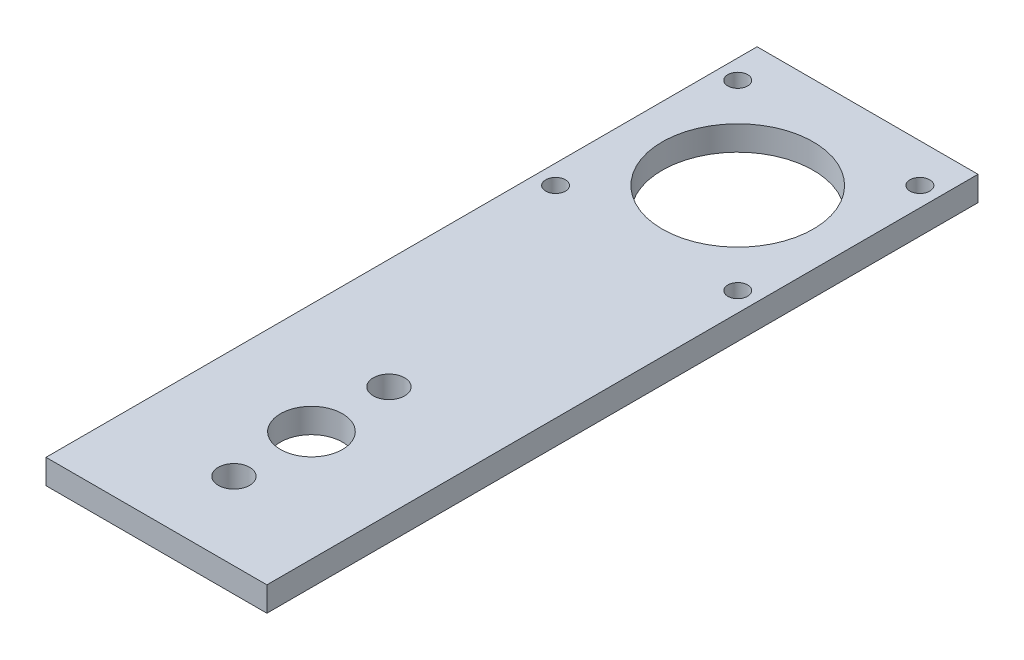
ISO-10303-21;
HEADER;
FILE_DESCRIPTION(('STEP AP214'),'2;1');
FILE_NAME('part.step','',(''),(''),'','','');
FILE_SCHEMA(('AUTOMOTIVE_DESIGN { 1 0 10303 214 1 1 1 1 }'));
ENDSEC;
DATA;
#1=APPLICATION_CONTEXT('core data for automotive mechanical design processes');
#2=APPLICATION_PROTOCOL_DEFINITION('international standard','automotive_design',2000,#1);
#3=PRODUCT_CONTEXT('',#1,'mechanical');
#4=PRODUCT('Part','Part','',(#3));
#5=PRODUCT_RELATED_PRODUCT_CATEGORY('part','',(#4));
#6=PRODUCT_DEFINITION_FORMATION('','',#4);
#7=PRODUCT_DEFINITION_CONTEXT('part definition',#1,'design');
#8=PRODUCT_DEFINITION('design','',#6,#7);
#9=PRODUCT_DEFINITION_SHAPE('','',#8);
#10=(LENGTH_UNIT() NAMED_UNIT(*) SI_UNIT(.MILLI.,.METRE.));
#11=(NAMED_UNIT(*) PLANE_ANGLE_UNIT() SI_UNIT($,.RADIAN.));
#12=(NAMED_UNIT(*) SI_UNIT($,.STERADIAN.) SOLID_ANGLE_UNIT());
#13=UNCERTAINTY_MEASURE_WITH_UNIT(LENGTH_MEASURE(1.E-05),#10,'distance_accuracy_value','');
#14=(GEOMETRIC_REPRESENTATION_CONTEXT(3) GLOBAL_UNCERTAINTY_ASSIGNED_CONTEXT((#13)) GLOBAL_UNIT_ASSIGNED_CONTEXT((#10,
#11,#12)) REPRESENTATION_CONTEXT('',''));
#15=CARTESIAN_POINT('',(0.,0.,0.));
#16=DIRECTION('',(0.,0.,1.));
#17=DIRECTION('',(1.,0.,0.));
#18=AXIS2_PLACEMENT_3D('',#15,#16,#17);
#19=CARTESIAN_POINT('',(0.,6.35,0.));
#20=DIRECTION('',(0.,1.,0.));
#21=DIRECTION('',(0.,0.,1.));
#22=AXIS2_PLACEMENT_3D('',#19,#20,#21);
#23=PLANE('',#22);
#24=CARTESIAN_POINT('',(0.,6.35,130.));
#25=DIRECTION('',(0.,1.,0.));
#26=DIRECTION('',(0.,0.,1.));
#27=AXIS2_PLACEMENT_3D('',#24,#25,#26);
#28=CIRCLE('',#27,4.05);
#29=CARTESIAN_POINT('',(0.,6.35,134.05));
#30=VERTEX_POINT('',#29);
#31=EDGE_CURVE('E144',#30,#30,#28,.T.);
#32=ORIENTED_EDGE('',*,*,#31,.F.);
#33=EDGE_LOOP('',(#32));
#34=FACE_BOUND('',#33,.T.);
#35=CARTESIAN_POINT('',(-23.5,6.35,23.5));
#36=DIRECTION('',(0.,1.,0.));
#37=DIRECTION('',(0.,0.,1.));
#38=AXIS2_PLACEMENT_3D('',#35,#36,#37);
#39=CIRCLE('',#38,2.55);
#40=CARTESIAN_POINT('',(-23.5,6.35,26.05));
#41=VERTEX_POINT('',#40);
#42=EDGE_CURVE('E132',#41,#41,#39,.T.);
#43=ORIENTED_EDGE('',*,*,#42,.F.);
#44=EDGE_LOOP('',(#43));
#45=FACE_BOUND('',#44,.T.);
#46=CARTESIAN_POINT('',(23.5,6.35,-23.5));
#47=DIRECTION('',(0.,1.,0.));
#48=DIRECTION('',(0.,0.,1.));
#49=AXIS2_PLACEMENT_3D('',#46,#47,#48);
#50=CIRCLE('',#49,2.55);
#51=CARTESIAN_POINT('',(23.5,6.35,-20.95));
#52=VERTEX_POINT('',#51);
#53=EDGE_CURVE('E120',#52,#52,#50,.T.);
#54=ORIENTED_EDGE('',*,*,#53,.F.);
#55=EDGE_LOOP('',(#54));
#56=FACE_BOUND('',#55,.T.);
#57=CARTESIAN_POINT('',(0.,6.35,0.));
#58=DIRECTION('',(0.,1.,0.));
#59=DIRECTION('',(0.,0.,1.));
#60=AXIS2_PLACEMENT_3D('',#57,#58,#59);
#61=CIRCLE('',#60,19.5);
#62=CARTESIAN_POINT('',(0.,6.35,19.5));
#63=VERTEX_POINT('',#62);
#64=EDGE_CURVE('E99',#63,#63,#61,.T.);
#65=ORIENTED_EDGE('',*,*,#64,.F.);
#66=EDGE_LOOP('',(#65));
#67=FACE_BOUND('',#66,.T.);
#68=DIRECTION('',(0.,0.,1.));
#69=VECTOR('',#68,1.);
#70=CARTESIAN_POINT('',(-28.5,6.35,-33.5));
#71=LINE('',#70,#69);
#72=CARTESIAN_POINT('',(-28.5,6.35,-33.5));
#73=VERTEX_POINT('',#72);
#74=CARTESIAN_POINT('',(-28.5,6.35,150.));
#75=VERTEX_POINT('',#74);
#76=EDGE_CURVE('E84',#73,#75,#71,.T.);
#77=ORIENTED_EDGE('',*,*,#76,.T.);
#78=DIRECTION('',(1.,0.,0.));
#79=VECTOR('',#78,1.);
#80=CARTESIAN_POINT('',(-28.5,6.35,150.));
#81=LINE('',#80,#79);
#82=CARTESIAN_POINT('',(28.5,6.35,150.));
#83=VERTEX_POINT('',#82);
#84=EDGE_CURVE('E79',#75,#83,#81,.T.);
#85=ORIENTED_EDGE('',*,*,#84,.T.);
#86=DIRECTION('',(0.,0.,-1.));
#87=VECTOR('',#86,1.);
#88=CARTESIAN_POINT('',(28.5,6.35,-33.5));
#89=LINE('',#88,#87);
#90=CARTESIAN_POINT('',(28.5,6.35,-33.5));
#91=VERTEX_POINT('',#90);
#92=EDGE_CURVE('E82',#83,#91,#89,.T.);
#93=ORIENTED_EDGE('',*,*,#92,.T.);
#94=DIRECTION('',(-1.,0.,0.));
#95=VECTOR('',#94,1.);
#96=CARTESIAN_POINT('',(-28.5,6.35,-33.5));
#97=LINE('',#96,#95);
#98=EDGE_CURVE('E49',#91,#73,#97,.T.);
#99=ORIENTED_EDGE('',*,*,#98,.T.);
#100=EDGE_LOOP('',(#77,#85,#93,#99));
#101=FACE_BOUND('',#100,.T.);
#102=CARTESIAN_POINT('',(-23.5,6.35,-23.5));
#103=DIRECTION('',(0.,1.,0.));
#104=DIRECTION('',(0.,0.,1.));
#105=AXIS2_PLACEMENT_3D('',#102,#103,#104);
#106=CIRCLE('',#105,2.55);
#107=CARTESIAN_POINT('',(-23.5,6.35,-20.95));
#108=VERTEX_POINT('',#107);
#109=EDGE_CURVE('E114',#108,#108,#106,.T.);
#110=ORIENTED_EDGE('',*,*,#109,.F.);
#111=EDGE_LOOP('',(#110));
#112=FACE_BOUND('',#111,.T.);
#113=CARTESIAN_POINT('',(23.5,6.35,23.5));
#114=DIRECTION('',(0.,1.,0.));
#115=DIRECTION('',(0.,0.,1.));
#116=AXIS2_PLACEMENT_3D('',#113,#114,#115);
#117=CIRCLE('',#116,2.55);
#118=CARTESIAN_POINT('',(23.5,6.35,26.05));
#119=VERTEX_POINT('',#118);
#120=EDGE_CURVE('E126',#119,#119,#117,.T.);
#121=ORIENTED_EDGE('',*,*,#120,.F.);
#122=EDGE_LOOP('',(#121));
#123=FACE_BOUND('',#122,.T.);
#124=CARTESIAN_POINT('',(0.,6.35,90.));
#125=DIRECTION('',(0.,1.,0.));
#126=DIRECTION('',(0.,0.,1.));
#127=AXIS2_PLACEMENT_3D('',#124,#125,#126);
#128=CIRCLE('',#127,4.05);
#129=CARTESIAN_POINT('',(0.,6.35,94.05));
#130=VERTEX_POINT('',#129);
#131=EDGE_CURVE('E138',#130,#130,#128,.T.);
#132=ORIENTED_EDGE('',*,*,#131,.F.);
#133=EDGE_LOOP('',(#132));
#134=FACE_BOUND('',#133,.T.);
#135=CARTESIAN_POINT('',(0.,6.35,110.));
#136=DIRECTION('',(0.,1.,0.));
#137=DIRECTION('',(0.,0.,1.));
#138=AXIS2_PLACEMENT_3D('',#135,#136,#137);
#139=CIRCLE('',#138,8.00000000000001);
#140=CARTESIAN_POINT('',(0.,6.35,118.));
#141=VERTEX_POINT('',#140);
#142=EDGE_CURVE('E150',#141,#141,#139,.T.);
#143=ORIENTED_EDGE('',*,*,#142,.F.);
#144=EDGE_LOOP('',(#143));
#145=FACE_BOUND('',#144,.T.);
#146=ADVANCED_FACE('F32',(#34,#45,#56,#67,#101,#112,#123,#134,#145),#23,.T.);
#147=CARTESIAN_POINT('',(0.,0.,0.));
#148=DIRECTION('',(0.,1.,0.));
#149=DIRECTION('',(0.,0.,1.));
#150=AXIS2_PLACEMENT_3D('',#147,#148,#149);
#151=PLANE('',#150);
#152=CARTESIAN_POINT('',(0.,0.,130.));
#153=DIRECTION('',(0.,1.,0.));
#154=DIRECTION('',(0.,0.,1.));
#155=AXIS2_PLACEMENT_3D('',#152,#153,#154);
#156=CIRCLE('',#155,4.05);
#157=CARTESIAN_POINT('',(0.,0.,134.05));
#158=VERTEX_POINT('',#157);
#159=EDGE_CURVE('E147',#158,#158,#156,.T.);
#160=ORIENTED_EDGE('',*,*,#159,.T.);
#161=EDGE_LOOP('',(#160));
#162=FACE_BOUND('',#161,.T.);
#163=CARTESIAN_POINT('',(-23.5,0.,23.5));
#164=DIRECTION('',(0.,1.,0.));
#165=DIRECTION('',(0.,0.,1.));
#166=AXIS2_PLACEMENT_3D('',#163,#164,#165);
#167=CIRCLE('',#166,2.55);
#168=CARTESIAN_POINT('',(-23.5,0.,26.05));
#169=VERTEX_POINT('',#168);
#170=EDGE_CURVE('E135',#169,#169,#167,.T.);
#171=ORIENTED_EDGE('',*,*,#170,.T.);
#172=EDGE_LOOP('',(#171));
#173=FACE_BOUND('',#172,.T.);
#174=CARTESIAN_POINT('',(23.5,0.,-23.5));
#175=DIRECTION('',(0.,1.,0.));
#176=DIRECTION('',(0.,0.,1.));
#177=AXIS2_PLACEMENT_3D('',#174,#175,#176);
#178=CIRCLE('',#177,2.55);
#179=CARTESIAN_POINT('',(23.5,0.,-20.95));
#180=VERTEX_POINT('',#179);
#181=EDGE_CURVE('E123',#180,#180,#178,.T.);
#182=ORIENTED_EDGE('',*,*,#181,.T.);
#183=EDGE_LOOP('',(#182));
#184=FACE_BOUND('',#183,.T.);
#185=CARTESIAN_POINT('',(0.,0.,0.));
#186=DIRECTION('',(0.,1.,0.));
#187=DIRECTION('',(0.,0.,1.));
#188=AXIS2_PLACEMENT_3D('',#185,#186,#187);
#189=CIRCLE('',#188,19.5);
#190=CARTESIAN_POINT('',(0.,0.,19.5));
#191=VERTEX_POINT('',#190);
#192=EDGE_CURVE('E111',#191,#191,#189,.T.);
#193=ORIENTED_EDGE('',*,*,#192,.T.);
#194=EDGE_LOOP('',(#193));
#195=FACE_BOUND('',#194,.T.);
#196=DIRECTION('',(0.,0.,1.));
#197=VECTOR('',#196,1.);
#198=CARTESIAN_POINT('',(-28.5,0.,-33.5));
#199=LINE('',#198,#197);
#200=CARTESIAN_POINT('',(-28.5,0.,-33.5));
#201=VERTEX_POINT('',#200);
#202=CARTESIAN_POINT('',(-28.5,0.,150.));
#203=VERTEX_POINT('',#202);
#204=EDGE_CURVE('E96',#201,#203,#199,.T.);
#205=ORIENTED_EDGE('',*,*,#204,.F.);
#206=DIRECTION('',(-1.,0.,0.));
#207=VECTOR('',#206,1.);
#208=CARTESIAN_POINT('',(-28.5,0.,-33.5));
#209=LINE('',#208,#207);
#210=CARTESIAN_POINT('',(28.5,0.,-33.5));
#211=VERTEX_POINT('',#210);
#212=EDGE_CURVE('E72',#211,#201,#209,.T.);
#213=ORIENTED_EDGE('',*,*,#212,.F.);
#214=DIRECTION('',(0.,0.,-1.));
#215=VECTOR('',#214,1.);
#216=CARTESIAN_POINT('',(28.5,0.,-33.5));
#217=LINE('',#216,#215);
#218=CARTESIAN_POINT('',(28.5,0.,150.));
#219=VERTEX_POINT('',#218);
#220=EDGE_CURVE('E66',#219,#211,#217,.T.);
#221=ORIENTED_EDGE('',*,*,#220,.F.);
#222=DIRECTION('',(1.,0.,0.));
#223=VECTOR('',#222,1.);
#224=CARTESIAN_POINT('',(-28.5,0.,150.));
#225=LINE('',#224,#223);
#226=EDGE_CURVE('E88',#203,#219,#225,.T.);
#227=ORIENTED_EDGE('',*,*,#226,.F.);
#228=EDGE_LOOP('',(#205,#213,#221,#227));
#229=FACE_BOUND('',#228,.T.);
#230=CARTESIAN_POINT('',(-23.5,0.,-23.5));
#231=DIRECTION('',(0.,1.,0.));
#232=DIRECTION('',(0.,0.,1.));
#233=AXIS2_PLACEMENT_3D('',#230,#231,#232);
#234=CIRCLE('',#233,2.55);
#235=CARTESIAN_POINT('',(-23.5,0.,-20.95));
#236=VERTEX_POINT('',#235);
#237=EDGE_CURVE('E117',#236,#236,#234,.T.);
#238=ORIENTED_EDGE('',*,*,#237,.T.);
#239=EDGE_LOOP('',(#238));
#240=FACE_BOUND('',#239,.T.);
#241=CARTESIAN_POINT('',(23.5,0.,23.5));
#242=DIRECTION('',(0.,1.,0.));
#243=DIRECTION('',(0.,0.,1.));
#244=AXIS2_PLACEMENT_3D('',#241,#242,#243);
#245=CIRCLE('',#244,2.55);
#246=CARTESIAN_POINT('',(23.5,0.,26.05));
#247=VERTEX_POINT('',#246);
#248=EDGE_CURVE('E129',#247,#247,#245,.T.);
#249=ORIENTED_EDGE('',*,*,#248,.T.);
#250=EDGE_LOOP('',(#249));
#251=FACE_BOUND('',#250,.T.);
#252=CARTESIAN_POINT('',(0.,0.,90.));
#253=DIRECTION('',(0.,1.,0.));
#254=DIRECTION('',(0.,0.,1.));
#255=AXIS2_PLACEMENT_3D('',#252,#253,#254);
#256=CIRCLE('',#255,4.05);
#257=CARTESIAN_POINT('',(0.,0.,94.05));
#258=VERTEX_POINT('',#257);
#259=EDGE_CURVE('E141',#258,#258,#256,.T.);
#260=ORIENTED_EDGE('',*,*,#259,.T.);
#261=EDGE_LOOP('',(#260));
#262=FACE_BOUND('',#261,.T.);
#263=CARTESIAN_POINT('',(0.,0.,110.));
#264=DIRECTION('',(0.,1.,0.));
#265=DIRECTION('',(0.,0.,1.));
#266=AXIS2_PLACEMENT_3D('',#263,#264,#265);
#267=CIRCLE('',#266,8.00000000000001);
#268=CARTESIAN_POINT('',(0.,0.,118.));
#269=VERTEX_POINT('',#268);
#270=EDGE_CURVE('E153',#269,#269,#267,.T.);
#271=ORIENTED_EDGE('',*,*,#270,.T.);
#272=EDGE_LOOP('',(#271));
#273=FACE_BOUND('',#272,.T.);
#274=ADVANCED_FACE('F107',(#162,#173,#184,#195,#229,#240,#251,#262,#273),#151,.F.);
#275=CARTESIAN_POINT('',(-28.5,6.35,-33.5));
#276=DIRECTION('',(1.,0.,0.));
#277=DIRECTION('',(0.,0.,-1.));
#278=AXIS2_PLACEMENT_3D('',#275,#276,#277);
#279=PLANE('',#278);
#280=ORIENTED_EDGE('',*,*,#204,.T.);
#281=DIRECTION('',(0.,-1.,0.));
#282=VECTOR('',#281,1.);
#283=CARTESIAN_POINT('',(-28.5,6.35,150.));
#284=LINE('',#283,#282);
#285=EDGE_CURVE('E11',#75,#203,#284,.T.);
#286=ORIENTED_EDGE('',*,*,#285,.F.);
#287=ORIENTED_EDGE('',*,*,#76,.F.);
#288=DIRECTION('',(0.,-1.,0.));
#289=VECTOR('',#288,1.);
#290=CARTESIAN_POINT('',(-28.5,6.35,-33.5));
#291=LINE('',#290,#289);
#292=EDGE_CURVE('E92',#73,#201,#291,.T.);
#293=ORIENTED_EDGE('',*,*,#292,.T.);
#294=EDGE_LOOP('',(#280,#286,#287,#293));
#295=FACE_BOUND('',#294,.T.);
#296=ADVANCED_FACE('F34',(#295),#279,.F.);
#297=CARTESIAN_POINT('',(-28.5,6.35,150.));
#298=DIRECTION('',(0.,0.,-1.));
#299=DIRECTION('',(-1.,0.,0.));
#300=AXIS2_PLACEMENT_3D('',#297,#298,#299);
#301=PLANE('',#300);
#302=ORIENTED_EDGE('',*,*,#226,.T.);
#303=DIRECTION('',(0.,-1.,0.));
#304=VECTOR('',#303,1.);
#305=CARTESIAN_POINT('',(28.5,6.35,150.));
#306=LINE('',#305,#304);
#307=EDGE_CURVE('E41',#83,#219,#306,.T.);
#308=ORIENTED_EDGE('',*,*,#307,.F.);
#309=ORIENTED_EDGE('',*,*,#84,.F.);
#310=ORIENTED_EDGE('',*,*,#285,.T.);
#311=EDGE_LOOP('',(#302,#308,#309,#310));
#312=FACE_BOUND('',#311,.T.);
#313=ADVANCED_FACE('F87',(#312),#301,.F.);
#314=CARTESIAN_POINT('',(28.5,6.35,-33.5));
#315=DIRECTION('',(-1.,0.,0.));
#316=DIRECTION('',(0.,0.,1.));
#317=AXIS2_PLACEMENT_3D('',#314,#315,#316);
#318=PLANE('',#317);
#319=ORIENTED_EDGE('',*,*,#220,.T.);
#320=DIRECTION('',(0.,-1.,0.));
#321=VECTOR('',#320,1.);
#322=CARTESIAN_POINT('',(28.5,6.35,-33.5));
#323=LINE('',#322,#321);
#324=EDGE_CURVE('E89',#91,#211,#323,.T.);
#325=ORIENTED_EDGE('',*,*,#324,.F.);
#326=ORIENTED_EDGE('',*,*,#92,.F.);
#327=ORIENTED_EDGE('',*,*,#307,.T.);
#328=EDGE_LOOP('',(#319,#325,#326,#327));
#329=FACE_BOUND('',#328,.T.);
#330=ADVANCED_FACE('F90',(#329),#318,.F.);
#331=CARTESIAN_POINT('',(-28.5,6.35,-33.5));
#332=DIRECTION('',(0.,0.,1.));
#333=DIRECTION('',(1.,0.,0.));
#334=AXIS2_PLACEMENT_3D('',#331,#332,#333);
#335=PLANE('',#334);
#336=ORIENTED_EDGE('',*,*,#212,.T.);
#337=ORIENTED_EDGE('',*,*,#292,.F.);
#338=ORIENTED_EDGE('',*,*,#98,.F.);
#339=ORIENTED_EDGE('',*,*,#324,.T.);
#340=EDGE_LOOP('',(#336,#337,#338,#339));
#341=FACE_BOUND('',#340,.T.);
#342=ADVANCED_FACE('F104',(#341),#335,.F.);
#343=CARTESIAN_POINT('',(0.,6.35,0.));
#344=DIRECTION('',(0.,-1.,0.));
#345=DIRECTION('',(0.,0.,-1.));
#346=AXIS2_PLACEMENT_3D('',#343,#344,#345);
#347=CYLINDRICAL_SURFACE('',#346,19.5);
#348=ORIENTED_EDGE('',*,*,#64,.T.);
#349=EDGE_LOOP('',(#348));
#350=FACE_BOUND('',#349,.T.);
#351=ORIENTED_EDGE('',*,*,#192,.F.);
#352=EDGE_LOOP('',(#351));
#353=FACE_BOUND('',#352,.T.);
#354=ADVANCED_FACE('F173',(#350,#353),#347,.F.);
#355=CARTESIAN_POINT('',(-23.5,6.35,-23.5));
#356=DIRECTION('',(0.,-1.,0.));
#357=DIRECTION('',(0.,0.,-1.));
#358=AXIS2_PLACEMENT_3D('',#355,#356,#357);
#359=CYLINDRICAL_SURFACE('',#358,2.55);
#360=ORIENTED_EDGE('',*,*,#109,.T.);
#361=EDGE_LOOP('',(#360));
#362=FACE_BOUND('',#361,.T.);
#363=ORIENTED_EDGE('',*,*,#237,.F.);
#364=EDGE_LOOP('',(#363));
#365=FACE_BOUND('',#364,.T.);
#366=ADVANCED_FACE('F219',(#362,#365),#359,.F.);
#367=CARTESIAN_POINT('',(23.5,6.35,-23.5));
#368=DIRECTION('',(0.,-1.,0.));
#369=DIRECTION('',(0.,0.,-1.));
#370=AXIS2_PLACEMENT_3D('',#367,#368,#369);
#371=CYLINDRICAL_SURFACE('',#370,2.55);
#372=ORIENTED_EDGE('',*,*,#53,.T.);
#373=EDGE_LOOP('',(#372));
#374=FACE_BOUND('',#373,.T.);
#375=ORIENTED_EDGE('',*,*,#181,.F.);
#376=EDGE_LOOP('',(#375));
#377=FACE_BOUND('',#376,.T.);
#378=ADVANCED_FACE('F227',(#374,#377),#371,.F.);
#379=CARTESIAN_POINT('',(23.5,6.35,23.5));
#380=DIRECTION('',(0.,-1.,0.));
#381=DIRECTION('',(0.,0.,-1.));
#382=AXIS2_PLACEMENT_3D('',#379,#380,#381);
#383=CYLINDRICAL_SURFACE('',#382,2.55);
#384=ORIENTED_EDGE('',*,*,#120,.T.);
#385=EDGE_LOOP('',(#384));
#386=FACE_BOUND('',#385,.T.);
#387=ORIENTED_EDGE('',*,*,#248,.F.);
#388=EDGE_LOOP('',(#387));
#389=FACE_BOUND('',#388,.T.);
#390=ADVANCED_FACE('F235',(#386,#389),#383,.F.);
#391=CARTESIAN_POINT('',(-23.5,6.35,23.5));
#392=DIRECTION('',(0.,-1.,0.));
#393=DIRECTION('',(0.,0.,-1.));
#394=AXIS2_PLACEMENT_3D('',#391,#392,#393);
#395=CYLINDRICAL_SURFACE('',#394,2.55);
#396=ORIENTED_EDGE('',*,*,#42,.T.);
#397=EDGE_LOOP('',(#396));
#398=FACE_BOUND('',#397,.T.);
#399=ORIENTED_EDGE('',*,*,#170,.F.);
#400=EDGE_LOOP('',(#399));
#401=FACE_BOUND('',#400,.T.);
#402=ADVANCED_FACE('F244',(#398,#401),#395,.F.);
#403=CARTESIAN_POINT('',(0.,6.35,90.));
#404=DIRECTION('',(0.,-1.,0.));
#405=DIRECTION('',(0.,0.,-1.));
#406=AXIS2_PLACEMENT_3D('',#403,#404,#405);
#407=CYLINDRICAL_SURFACE('',#406,4.05);
#408=ORIENTED_EDGE('',*,*,#131,.T.);
#409=EDGE_LOOP('',(#408));
#410=FACE_BOUND('',#409,.T.);
#411=ORIENTED_EDGE('',*,*,#259,.F.);
#412=EDGE_LOOP('',(#411));
#413=FACE_BOUND('',#412,.T.);
#414=ADVANCED_FACE('F253',(#410,#413),#407,.F.);
#415=CARTESIAN_POINT('',(0.,6.35,130.));
#416=DIRECTION('',(0.,-1.,0.));
#417=DIRECTION('',(0.,0.,-1.));
#418=AXIS2_PLACEMENT_3D('',#415,#416,#417);
#419=CYLINDRICAL_SURFACE('',#418,4.05);
#420=ORIENTED_EDGE('',*,*,#31,.T.);
#421=EDGE_LOOP('',(#420));
#422=FACE_BOUND('',#421,.T.);
#423=ORIENTED_EDGE('',*,*,#159,.F.);
#424=EDGE_LOOP('',(#423));
#425=FACE_BOUND('',#424,.T.);
#426=ADVANCED_FACE('F262',(#422,#425),#419,.F.);
#427=CARTESIAN_POINT('',(0.,6.35,110.));
#428=DIRECTION('',(0.,-1.,0.));
#429=DIRECTION('',(0.,0.,-1.));
#430=AXIS2_PLACEMENT_3D('',#427,#428,#429);
#431=CYLINDRICAL_SURFACE('',#430,8.00000000000001);
#432=ORIENTED_EDGE('',*,*,#142,.T.);
#433=EDGE_LOOP('',(#432));
#434=FACE_BOUND('',#433,.T.);
#435=ORIENTED_EDGE('',*,*,#270,.F.);
#436=EDGE_LOOP('',(#435));
#437=FACE_BOUND('',#436,.T.);
#438=ADVANCED_FACE('F159',(#434,#437),#431,.F.);
#439=CLOSED_SHELL('',(#146,#274,#296,#313,#330,#342,#354,#366,#378,#390,#402,#414,#426,#438));
#440=MANIFOLD_SOLID_BREP('B2',#439);
#441=ADVANCED_BREP_SHAPE_REPRESENTATION('',(#18,#440),#14);
#442=SHAPE_DEFINITION_REPRESENTATION(#9,#441);
ENDSEC;
END-ISO-10303-21;
